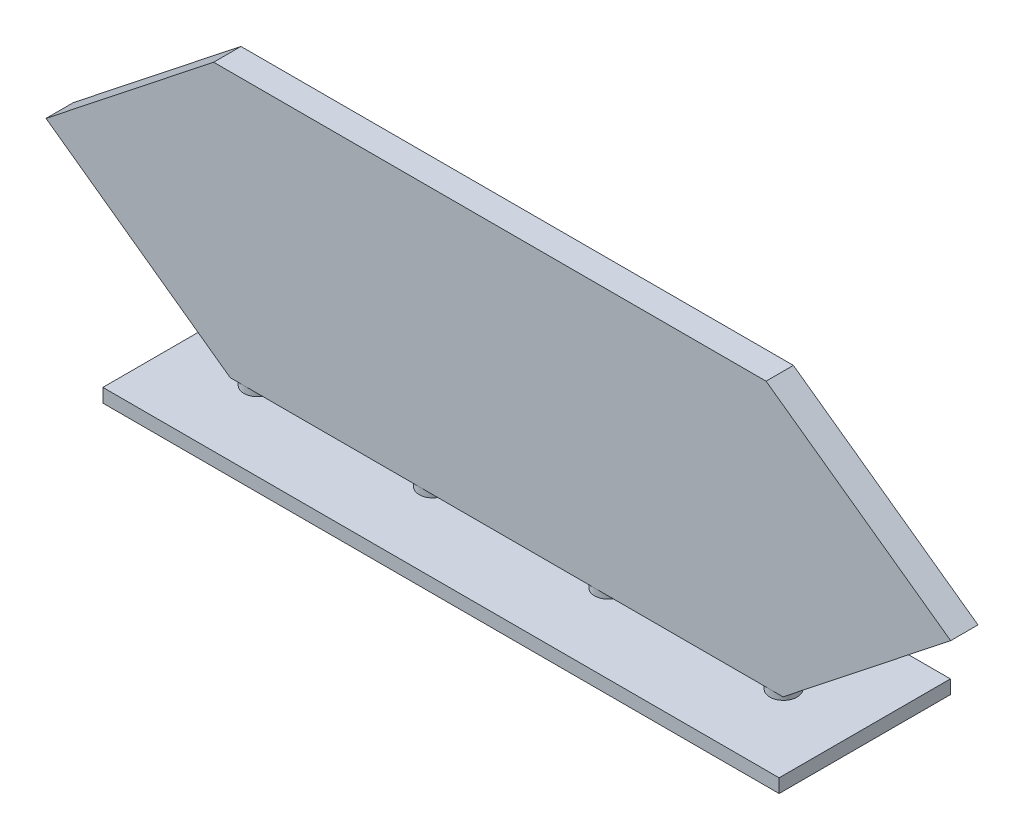
ISO-10303-21;
HEADER;
FILE_DESCRIPTION(('STEP AP214'),'2;1');
FILE_NAME('part.step','',(''),(''),'','','');
FILE_SCHEMA(('AUTOMOTIVE_DESIGN { 1 0 10303 214 1 1 1 1 }'));
ENDSEC;
DATA;
#1=APPLICATION_CONTEXT('core data for automotive mechanical design processes');
#2=APPLICATION_PROTOCOL_DEFINITION('international standard','automotive_design',2000,#1);
#3=PRODUCT_CONTEXT('',#1,'mechanical');
#4=PRODUCT('Part','Part','',(#3));
#5=PRODUCT_RELATED_PRODUCT_CATEGORY('part','',(#4));
#6=PRODUCT_DEFINITION_FORMATION('','',#4);
#7=PRODUCT_DEFINITION_CONTEXT('part definition',#1,'design');
#8=PRODUCT_DEFINITION('design','',#6,#7);
#9=PRODUCT_DEFINITION_SHAPE('','',#8);
#10=(LENGTH_UNIT() NAMED_UNIT(*) SI_UNIT(.MILLI.,.METRE.));
#11=(NAMED_UNIT(*) PLANE_ANGLE_UNIT() SI_UNIT($,.RADIAN.));
#12=(NAMED_UNIT(*) SI_UNIT($,.STERADIAN.) SOLID_ANGLE_UNIT());
#13=UNCERTAINTY_MEASURE_WITH_UNIT(LENGTH_MEASURE(1.E-05),#10,'distance_accuracy_value','');
#14=(GEOMETRIC_REPRESENTATION_CONTEXT(3) GLOBAL_UNCERTAINTY_ASSIGNED_CONTEXT((#13)) GLOBAL_UNIT_ASSIGNED_CONTEXT((#10,
#11,#12)) REPRESENTATION_CONTEXT('',''));
#15=CARTESIAN_POINT('',(0.,0.,0.));
#16=DIRECTION('',(0.,0.,1.));
#17=DIRECTION('',(1.,0.,0.));
#18=AXIS2_PLACEMENT_3D('',#15,#16,#17);
#19=CARTESIAN_POINT('',(-11.9054966201371,-5.81721391101613,0.));
#20=DIRECTION('',(0.,-1.,0.));
#21=DIRECTION('',(0.,0.,-1.));
#22=AXIS2_PLACEMENT_3D('',#19,#20,#21);
#23=PLANE('',#22);
#24=DIRECTION('',(1.,0.,0.));
#25=VECTOR('',#24,1.);
#26=CARTESIAN_POINT('',(-11.9054966201371,-5.81721391101613,1.2));
#27=LINE('',#26,#25);
#28=CARTESIAN_POINT('',(11.9233913677894,-5.81721391101613,1.2));
#29=VERTEX_POINT('',#28);
#30=CARTESIAN_POINT('',(12.5032995667402,-5.81721391101613,1.2));
#31=VERTEX_POINT('',#30);
#32=EDGE_CURVE('E301',#29,#31,#27,.T.);
#33=ORIENTED_EDGE('',*,*,#32,.F.);
#34=CARTESIAN_POINT('',(11.9233913677894,-5.81721391101613,0.6));
#35=DIRECTION('',(0.,-1.,0.));
#36=DIRECTION('',(0.,0.,-1.));
#37=AXIS2_PLACEMENT_3D('',#34,#35,#36);
#38=CIRCLE('',#37,0.6);
#39=CARTESIAN_POINT('',(12.5032995667402,-5.81721391101613,0.753969090370698));
#40=VERTEX_POINT('',#39);
#41=EDGE_CURVE('E384',#40,#29,#38,.T.);
#42=ORIENTED_EDGE('',*,*,#41,.F.);
#43=DIRECTION('',(0.,0.,1.));
#44=VECTOR('',#43,1.);
#45=CARTESIAN_POINT('',(12.5032995667402,-5.81721391101613,0.));
#46=LINE('',#45,#44);
#47=EDGE_CURVE('E316',#40,#31,#46,.T.);
#48=ORIENTED_EDGE('',*,*,#47,.T.);
#49=EDGE_LOOP('',(#33,#42,#48));
#50=FACE_BOUND('',#49,.T.);
#51=ADVANCED_FACE('F79',(#50),#23,.T.);
#52=DIRECTION('',(1.,0.,0.));
#53=VECTOR('',#52,1.);
#54=CARTESIAN_POINT('',(-11.9054966201371,-5.81721391101613,0.));
#55=LINE('',#54,#53);
#56=CARTESIAN_POINT('',(4.22339136778937,-5.81721391101613,0.));
#57=VERTEX_POINT('',#56);
#58=CARTESIAN_POINT('',(11.9233913677894,-5.81721391101613,0.));
#59=VERTEX_POINT('',#58);
#60=EDGE_CURVE('E394',#57,#59,#55,.T.);
#61=ORIENTED_EDGE('',*,*,#60,.T.);
#62=EDGE_CURVE('E227',#29,#59,#38,.T.);
#63=ORIENTED_EDGE('',*,*,#62,.F.);
#64=CARTESIAN_POINT('',(4.22339136778937,-5.81721391101613,1.2));
#65=VERTEX_POINT('',#64);
#66=EDGE_CURVE('E374',#65,#29,#27,.T.);
#67=ORIENTED_EDGE('',*,*,#66,.F.);
#68=CARTESIAN_POINT('',(4.22339136778937,-5.81721391101613,0.6));
#69=DIRECTION('',(0.,-1.,0.));
#70=DIRECTION('',(0.,0.,-1.));
#71=AXIS2_PLACEMENT_3D('',#68,#69,#70);
#72=CIRCLE('',#71,0.6);
#73=EDGE_CURVE('E239',#57,#65,#72,.T.);
#74=ORIENTED_EDGE('',*,*,#73,.F.);
#75=EDGE_LOOP('',(#61,#63,#67,#74));
#76=FACE_BOUND('',#75,.T.);
#77=ADVANCED_FACE('F391',(#76),#23,.T.);
#78=CARTESIAN_POINT('',(-3.47660863221063,-5.81721391101613,0.));
#79=VERTEX_POINT('',#78);
#80=EDGE_CURVE('E404',#79,#57,#55,.T.);
#81=ORIENTED_EDGE('',*,*,#80,.T.);
#82=EDGE_CURVE('E243',#65,#57,#72,.T.);
#83=ORIENTED_EDGE('',*,*,#82,.F.);
#84=CARTESIAN_POINT('',(-3.47660863221063,-5.81721391101613,1.2));
#85=VERTEX_POINT('',#84);
#86=EDGE_CURVE('E372',#85,#65,#27,.T.);
#87=ORIENTED_EDGE('',*,*,#86,.F.);
#88=CARTESIAN_POINT('',(-3.47660863221063,-5.81721391101613,0.6));
#89=DIRECTION('',(0.,-1.,0.));
#90=DIRECTION('',(0.,0.,-1.));
#91=AXIS2_PLACEMENT_3D('',#88,#89,#90);
#92=CIRCLE('',#91,0.6);
#93=EDGE_CURVE('E247',#79,#85,#92,.T.);
#94=ORIENTED_EDGE('',*,*,#93,.F.);
#95=EDGE_LOOP('',(#81,#83,#87,#94));
#96=FACE_BOUND('',#95,.T.);
#97=ADVANCED_FACE('F432',(#96),#23,.T.);
#98=CARTESIAN_POINT('',(-11.1766086322106,-5.81721391101613,0.));
#99=VERTEX_POINT('',#98);
#100=EDGE_CURVE('E282',#99,#79,#55,.T.);
#101=ORIENTED_EDGE('',*,*,#100,.T.);
#102=EDGE_CURVE('E250',#85,#79,#92,.T.);
#103=ORIENTED_EDGE('',*,*,#102,.F.);
#104=CARTESIAN_POINT('',(-11.1766086322106,-5.81721391101613,1.2));
#105=VERTEX_POINT('',#104);
#106=EDGE_CURVE('E306',#105,#85,#27,.T.);
#107=ORIENTED_EDGE('',*,*,#106,.F.);
#108=CARTESIAN_POINT('',(-11.1766086322106,-5.81721391101613,0.6));
#109=DIRECTION('',(0.,-1.,0.));
#110=DIRECTION('',(0.,0.,-1.));
#111=AXIS2_PLACEMENT_3D('',#108,#109,#110);
#112=CIRCLE('',#111,0.6);
#113=EDGE_CURVE('E91',#99,#105,#112,.T.);
#114=ORIENTED_EDGE('',*,*,#113,.F.);
#115=EDGE_LOOP('',(#101,#103,#107,#114));
#116=FACE_BOUND('',#115,.T.);
#117=ADVANCED_FACE('F368',(#116),#23,.T.);
#118=CARTESIAN_POINT('',(12.5032995667402,-5.81721391101613,0.));
#119=VERTEX_POINT('',#118);
#120=CARTESIAN_POINT('',(12.5032995667402,-5.81721391101613,0.446030909629301));
#121=VERTEX_POINT('',#120);
#122=EDGE_CURVE('E313',#119,#121,#46,.T.);
#123=ORIENTED_EDGE('',*,*,#122,.T.);
#124=EDGE_CURVE('E98',#59,#121,#38,.T.);
#125=ORIENTED_EDGE('',*,*,#124,.F.);
#126=EDGE_CURVE('E277',#59,#119,#55,.T.);
#127=ORIENTED_EDGE('',*,*,#126,.T.);
#128=EDGE_LOOP('',(#123,#125,#127));
#129=FACE_BOUND('',#128,.T.);
#130=ADVANCED_FACE('F412',(#129),#23,.T.);
#131=CARTESIAN_POINT('',(-11.7766086322106,-5.81721391101613,0.6));
#132=VERTEX_POINT('',#131);
#133=EDGE_CURVE('E12',#105,#132,#112,.T.);
#134=ORIENTED_EDGE('',*,*,#133,.F.);
#135=CARTESIAN_POINT('',(-11.7766086322106,-5.81721391101613,1.2));
#136=VERTEX_POINT('',#135);
#137=EDGE_CURVE('E302',#136,#105,#27,.T.);
#138=ORIENTED_EDGE('',*,*,#137,.F.);
#139=DIRECTION('',(0.,0.,1.));
#140=VECTOR('',#139,1.);
#141=CARTESIAN_POINT('',(-11.7766086322106,-5.81721391101613,0.));
#142=LINE('',#141,#140);
#143=EDGE_CURVE('E321',#132,#136,#142,.T.);
#144=ORIENTED_EDGE('',*,*,#143,.F.);
#145=EDGE_LOOP('',(#134,#138,#144));
#146=FACE_BOUND('',#145,.T.);
#147=ADVANCED_FACE('F360',(#146),#23,.T.);
#148=CARTESIAN_POINT('',(0.,0.,0.));
#149=DIRECTION('',(0.,0.,-1.));
#150=DIRECTION('',(-1.,0.,0.));
#151=AXIS2_PLACEMENT_3D('',#148,#149,#150);
#152=PLANE('',#151);
#153=DIRECTION('',(-1.,0.,0.));
#154=VECTOR('',#153,1.);
#155=CARTESIAN_POINT('',(11.8866222607191,5.81721391101613,0.));
#156=LINE('',#155,#154);
#157=CARTESIAN_POINT('',(11.7579690343913,5.81721391101613,0.));
#158=VERTEX_POINT('',#157);
#159=CARTESIAN_POINT('',(-12.5037603710876,5.81721391101613,0.));
#160=VERTEX_POINT('',#159);
#161=EDGE_CURVE('E264',#158,#160,#156,.T.);
#162=ORIENTED_EDGE('',*,*,#161,.F.);
#163=DIRECTION('',(-0.812500733959519,0.582960167863331,0.));
#164=VECTOR('',#163,1.);
#165=CARTESIAN_POINT('',(20.2972193800577,-0.309602480493432,0.));
#166=LINE('',#165,#164);
#167=CARTESIAN_POINT('',(19.86571092287,0.,0.));
#168=VERTEX_POINT('',#167);
#169=EDGE_CURVE('E261',#168,#158,#166,.T.);
#170=ORIENTED_EDGE('',*,*,#169,.F.);
#171=DIRECTION('',(0.78463474581421,0.619958317680366,0.));
#172=VECTOR('',#171,1.);
#173=CARTESIAN_POINT('',(12.3942709068087,-5.90336001269044,0.));
#174=LINE('',#173,#172);
#175=EDGE_CURVE('E281',#119,#168,#174,.T.);
#176=ORIENTED_EDGE('',*,*,#175,.F.);
#177=ORIENTED_EDGE('',*,*,#126,.F.);
#178=ORIENTED_EDGE('',*,*,#60,.F.);
#179=ORIENTED_EDGE('',*,*,#80,.F.);
#180=ORIENTED_EDGE('',*,*,#100,.F.);
#181=CARTESIAN_POINT('',(-11.7766086322106,-5.81721391101613,0.));
#182=VERTEX_POINT('',#181);
#183=EDGE_CURVE('E278',#182,#99,#55,.T.);
#184=ORIENTED_EDGE('',*,*,#183,.F.);
#185=DIRECTION('',(0.811880248653877,-0.583823999032001,0.));
#186=VECTOR('',#185,1.);
#187=CARTESIAN_POINT('',(-20.2968738475903,0.309718378695081,0.));
#188=LINE('',#187,#186);
#189=CARTESIAN_POINT('',(-19.8661717272174,0.,0.));
#190=VERTEX_POINT('',#189);
#191=EDGE_CURVE('E273',#190,#182,#188,.T.);
#192=ORIENTED_EDGE('',*,*,#191,.F.);
#193=DIRECTION('',(-0.784634745814211,-0.619958317680365,0.));
#194=VECTOR('',#193,1.);
#195=CARTESIAN_POINT('',(-12.3947317111561,5.90336001269044,0.));
#196=LINE('',#195,#194);
#197=EDGE_CURVE('E269',#160,#190,#196,.T.);
#198=ORIENTED_EDGE('',*,*,#197,.F.);
#199=EDGE_LOOP('',(#162,#170,#176,#177,#178,#179,#180,#184,#192,#198));
#200=FACE_BOUND('',#199,.T.);
#201=ADVANCED_FACE('F81',(#200),#152,.T.);
#202=CARTESIAN_POINT('',(20.2972193800577,-0.309602480493432,0.));
#203=DIRECTION('',(0.582960167863331,0.812500733959519,0.));
#204=DIRECTION('',(-0.812500733959519,0.582960167863331,0.));
#205=AXIS2_PLACEMENT_3D('',#202,#203,#204);
#206=PLANE('',#205);
#207=DIRECTION('',(-0.812500733959519,0.582960167863331,0.));
#208=VECTOR('',#207,1.);
#209=CARTESIAN_POINT('',(20.2972193800577,-0.309602480493432,1.2));
#210=LINE('',#209,#208);
#211=CARTESIAN_POINT('',(19.86571092287,0.,1.2));
#212=VERTEX_POINT('',#211);
#213=CARTESIAN_POINT('',(11.7579690343913,5.81721391101613,1.2));
#214=VERTEX_POINT('',#213);
#215=EDGE_CURVE('E257',#212,#214,#210,.T.);
#216=ORIENTED_EDGE('',*,*,#215,.F.);
#217=DIRECTION('',(0.,0.,1.));
#218=VECTOR('',#217,1.);
#219=CARTESIAN_POINT('',(19.86571092287,0.,0.));
#220=LINE('',#219,#218);
#221=EDGE_CURVE('E310',#168,#212,#220,.T.);
#222=ORIENTED_EDGE('',*,*,#221,.F.);
#223=ORIENTED_EDGE('',*,*,#169,.T.);
#224=DIRECTION('',(0.,0.,1.));
#225=VECTOR('',#224,1.);
#226=CARTESIAN_POINT('',(11.7579690343913,5.81721391101613,0.));
#227=LINE('',#226,#225);
#228=EDGE_CURVE('E83',#158,#214,#227,.T.);
#229=ORIENTED_EDGE('',*,*,#228,.T.);
#230=EDGE_LOOP('',(#216,#222,#223,#229));
#231=FACE_BOUND('',#230,.T.);
#232=ADVANCED_FACE('F333',(#231),#206,.T.);
#233=CARTESIAN_POINT('',(12.3942709068087,-5.90336001269044,0.));
#234=DIRECTION('',(0.619958317680366,-0.78463474581421,0.));
#235=DIRECTION('',(0.784634745814211,0.619958317680366,0.));
#236=AXIS2_PLACEMENT_3D('',#233,#234,#235);
#237=PLANE('',#236);
#238=DIRECTION('',(0.78463474581421,0.619958317680366,0.));
#239=VECTOR('',#238,1.);
#240=CARTESIAN_POINT('',(12.3942709068087,-5.90336001269044,1.2));
#241=LINE('',#240,#239);
#242=EDGE_CURVE('E265',#31,#212,#241,.T.);
#243=ORIENTED_EDGE('',*,*,#242,.F.);
#244=ORIENTED_EDGE('',*,*,#47,.F.);
#245=DIRECTION('',(0.,0.,-1.));
#246=VECTOR('',#245,1.);
#247=CARTESIAN_POINT('',(12.5032995667402,-5.81721391101613,0.));
#248=LINE('',#247,#246);
#249=EDGE_CURVE('E106',#40,#121,#248,.T.);
#250=ORIENTED_EDGE('',*,*,#249,.T.);
#251=ORIENTED_EDGE('',*,*,#122,.F.);
#252=ORIENTED_EDGE('',*,*,#175,.T.);
#253=ORIENTED_EDGE('',*,*,#221,.T.);
#254=EDGE_LOOP('',(#243,#244,#250,#251,#252,#253));
#255=FACE_BOUND('',#254,.T.);
#256=ADVANCED_FACE('F343',(#255),#237,.T.);
#257=EDGE_CURVE('E89',#132,#99,#112,.T.);
#258=ORIENTED_EDGE('',*,*,#257,.F.);
#259=EDGE_CURVE('E317',#182,#132,#142,.T.);
#260=ORIENTED_EDGE('',*,*,#259,.F.);
#261=ORIENTED_EDGE('',*,*,#183,.T.);
#262=EDGE_LOOP('',(#258,#260,#261));
#263=FACE_BOUND('',#262,.T.);
#264=ADVANCED_FACE('F400',(#263),#23,.T.);
#265=CARTESIAN_POINT('',(-20.2968738475903,0.309718378695081,0.));
#266=DIRECTION('',(-0.583823999032001,-0.811880248653877,0.));
#267=DIRECTION('',(0.811880248653877,-0.583823999032002,0.));
#268=AXIS2_PLACEMENT_3D('',#265,#266,#267);
#269=PLANE('',#268);
#270=DIRECTION('',(0.811880248653877,-0.583823999032001,0.));
#271=VECTOR('',#270,1.);
#272=CARTESIAN_POINT('',(-20.2968738475903,0.309718378695081,1.2));
#273=LINE('',#272,#271);
#274=CARTESIAN_POINT('',(-19.8661717272174,0.,1.2));
#275=VERTEX_POINT('',#274);
#276=EDGE_CURVE('E297',#275,#136,#273,.T.);
#277=ORIENTED_EDGE('',*,*,#276,.F.);
#278=DIRECTION('',(0.,0.,1.));
#279=VECTOR('',#278,1.);
#280=CARTESIAN_POINT('',(-19.8661717272174,0.,0.));
#281=LINE('',#280,#279);
#282=EDGE_CURVE('E322',#190,#275,#281,.T.);
#283=ORIENTED_EDGE('',*,*,#282,.F.);
#284=ORIENTED_EDGE('',*,*,#191,.T.);
#285=ORIENTED_EDGE('',*,*,#259,.T.);
#286=ORIENTED_EDGE('',*,*,#143,.T.);
#287=EDGE_LOOP('',(#277,#283,#284,#285,#286));
#288=FACE_BOUND('',#287,.T.);
#289=ADVANCED_FACE('F356',(#288),#269,.T.);
#290=CARTESIAN_POINT('',(-12.3947317111561,5.90336001269044,0.));
#291=DIRECTION('',(-0.619958317680365,0.784634745814211,0.));
#292=DIRECTION('',(-0.784634745814211,-0.619958317680365,0.));
#293=AXIS2_PLACEMENT_3D('',#290,#291,#292);
#294=PLANE('',#293);
#295=DIRECTION('',(-0.784634745814211,-0.619958317680365,0.));
#296=VECTOR('',#295,1.);
#297=CARTESIAN_POINT('',(-12.3947317111561,5.90336001269044,1.2));
#298=LINE('',#297,#296);
#299=CARTESIAN_POINT('',(-12.5037603710876,5.81721391101613,1.2));
#300=VERTEX_POINT('',#299);
#301=EDGE_CURVE('E293',#300,#275,#298,.T.);
#302=ORIENTED_EDGE('',*,*,#301,.F.);
#303=DIRECTION('',(0.,0.,1.));
#304=VECTOR('',#303,1.);
#305=CARTESIAN_POINT('',(-12.5037603710876,5.81721391101613,0.));
#306=LINE('',#305,#304);
#307=EDGE_CURVE('E324',#160,#300,#306,.T.);
#308=ORIENTED_EDGE('',*,*,#307,.F.);
#309=ORIENTED_EDGE('',*,*,#197,.T.);
#310=ORIENTED_EDGE('',*,*,#282,.T.);
#311=EDGE_LOOP('',(#302,#308,#309,#310));
#312=FACE_BOUND('',#311,.T.);
#313=ADVANCED_FACE('F351',(#312),#294,.T.);
#314=CARTESIAN_POINT('',(11.8866222607191,5.81721391101613,0.));
#315=DIRECTION('',(0.,1.,0.));
#316=DIRECTION('',(0.,0.,1.));
#317=AXIS2_PLACEMENT_3D('',#314,#315,#316);
#318=PLANE('',#317);
#319=DIRECTION('',(-1.,0.,0.));
#320=VECTOR('',#319,1.);
#321=CARTESIAN_POINT('',(11.8866222607191,5.81721391101613,1.2));
#322=LINE('',#321,#320);
#323=EDGE_CURVE('E289',#214,#300,#322,.T.);
#324=ORIENTED_EDGE('',*,*,#323,.F.);
#325=ORIENTED_EDGE('',*,*,#228,.F.);
#326=ORIENTED_EDGE('',*,*,#161,.T.);
#327=ORIENTED_EDGE('',*,*,#307,.T.);
#328=EDGE_LOOP('',(#324,#325,#326,#327));
#329=FACE_BOUND('',#328,.T.);
#330=ADVANCED_FACE('F336',(#329),#318,.T.);
#331=CARTESIAN_POINT('',(0.,0.,1.2));
#332=DIRECTION('',(0.,0.,-1.));
#333=DIRECTION('',(-1.,0.,0.));
#334=AXIS2_PLACEMENT_3D('',#331,#332,#333);
#335=PLANE('',#334);
#336=ORIENTED_EDGE('',*,*,#215,.T.);
#337=ORIENTED_EDGE('',*,*,#323,.T.);
#338=ORIENTED_EDGE('',*,*,#301,.T.);
#339=ORIENTED_EDGE('',*,*,#276,.T.);
#340=ORIENTED_EDGE('',*,*,#137,.T.);
#341=ORIENTED_EDGE('',*,*,#106,.T.);
#342=ORIENTED_EDGE('',*,*,#86,.T.);
#343=ORIENTED_EDGE('',*,*,#66,.T.);
#344=ORIENTED_EDGE('',*,*,#32,.T.);
#345=ORIENTED_EDGE('',*,*,#242,.T.);
#346=EDGE_LOOP('',(#336,#337,#338,#339,#340,#341,#342,#343,#344,#345));
#347=FACE_BOUND('',#346,.T.);
#348=ADVANCED_FACE('F338',(#347),#335,.F.);
#349=CARTESIAN_POINT('',(-11.1766086322106,-6.11721391101613,0.6));
#350=DIRECTION('',(0.,1.,0.));
#351=DIRECTION('',(0.,0.,1.));
#352=AXIS2_PLACEMENT_3D('',#349,#350,#351);
#353=CYLINDRICAL_SURFACE('',#352,0.6);
#354=CARTESIAN_POINT('',(-11.1766086322106,-6.11721391101613,0.6));
#355=DIRECTION('',(0.,-1.,0.));
#356=DIRECTION('',(0.,0.,-1.));
#357=AXIS2_PLACEMENT_3D('',#354,#355,#356);
#358=CIRCLE('',#357,0.6);
#359=CARTESIAN_POINT('',(-11.1766086322106,-6.11721391101613,0.));
#360=VERTEX_POINT('',#359);
#361=EDGE_CURVE('E254',#360,#360,#358,.T.);
#362=ORIENTED_EDGE('',*,*,#361,.F.);
#363=EDGE_LOOP('',(#362));
#364=FACE_BOUND('',#363,.T.);
#365=ORIENTED_EDGE('',*,*,#113,.T.);
#366=ORIENTED_EDGE('',*,*,#133,.T.);
#367=ORIENTED_EDGE('',*,*,#257,.T.);
#368=EDGE_LOOP('',(#365,#366,#367));
#369=FACE_BOUND('',#368,.T.);
#370=ADVANCED_FACE('F398',(#364,#369),#353,.T.);
#371=CARTESIAN_POINT('',(-3.47660863221063,-6.11721391101613,0.6));
#372=DIRECTION('',(0.,1.,0.));
#373=DIRECTION('',(0.,0.,1.));
#374=AXIS2_PLACEMENT_3D('',#371,#372,#373);
#375=CYLINDRICAL_SURFACE('',#374,0.6);
#376=CARTESIAN_POINT('',(-3.47660863221063,-6.11721391101613,0.6));
#377=DIRECTION('',(0.,-1.,0.));
#378=DIRECTION('',(0.,0.,-1.));
#379=AXIS2_PLACEMENT_3D('',#376,#377,#378);
#380=CIRCLE('',#379,0.6);
#381=CARTESIAN_POINT('',(-3.47660863221063,-6.11721391101613,0.));
#382=VERTEX_POINT('',#381);
#383=EDGE_CURVE('E242',#382,#382,#380,.T.);
#384=ORIENTED_EDGE('',*,*,#383,.F.);
#385=EDGE_LOOP('',(#384));
#386=FACE_BOUND('',#385,.T.);
#387=ORIENTED_EDGE('',*,*,#93,.T.);
#388=ORIENTED_EDGE('',*,*,#102,.T.);
#389=EDGE_LOOP('',(#387,#388));
#390=FACE_BOUND('',#389,.T.);
#391=ADVANCED_FACE('F529',(#386,#390),#375,.T.);
#392=CARTESIAN_POINT('',(4.22339136778937,-6.11721391101613,0.6));
#393=DIRECTION('',(0.,1.,0.));
#394=DIRECTION('',(0.,0.,1.));
#395=AXIS2_PLACEMENT_3D('',#392,#393,#394);
#396=CYLINDRICAL_SURFACE('',#395,0.6);
#397=CARTESIAN_POINT('',(4.22339136778937,-6.11721391101613,0.6));
#398=DIRECTION('',(0.,-1.,0.));
#399=DIRECTION('',(0.,0.,-1.));
#400=AXIS2_PLACEMENT_3D('',#397,#398,#399);
#401=CIRCLE('',#400,0.6);
#402=CARTESIAN_POINT('',(4.22339136778937,-6.11721391101613,0.));
#403=VERTEX_POINT('',#402);
#404=EDGE_CURVE('E238',#403,#403,#401,.T.);
#405=ORIENTED_EDGE('',*,*,#404,.F.);
#406=EDGE_LOOP('',(#405));
#407=FACE_BOUND('',#406,.T.);
#408=ORIENTED_EDGE('',*,*,#73,.T.);
#409=ORIENTED_EDGE('',*,*,#82,.T.);
#410=EDGE_LOOP('',(#408,#409));
#411=FACE_BOUND('',#410,.T.);
#412=ADVANCED_FACE('F423',(#407,#411),#396,.T.);
#413=CARTESIAN_POINT('',(11.9233913677894,-6.11721391101613,0.6));
#414=DIRECTION('',(0.,1.,0.));
#415=DIRECTION('',(0.,0.,1.));
#416=AXIS2_PLACEMENT_3D('',#413,#414,#415);
#417=CYLINDRICAL_SURFACE('',#416,0.6);
#418=CARTESIAN_POINT('',(11.9233913677894,-6.11721391101613,0.6));
#419=DIRECTION('',(0.,-1.,0.));
#420=DIRECTION('',(0.,0.,-1.));
#421=AXIS2_PLACEMENT_3D('',#418,#419,#420);
#422=CIRCLE('',#421,0.6);
#423=CARTESIAN_POINT('',(11.9233913677894,-6.11721391101613,0.));
#424=VERTEX_POINT('',#423);
#425=EDGE_CURVE('E222',#424,#424,#422,.T.);
#426=ORIENTED_EDGE('',*,*,#425,.F.);
#427=EDGE_LOOP('',(#426));
#428=FACE_BOUND('',#427,.T.);
#429=ORIENTED_EDGE('',*,*,#124,.T.);
#430=EDGE_CURVE('E234',#121,#40,#38,.T.);
#431=ORIENTED_EDGE('',*,*,#430,.T.);
#432=ORIENTED_EDGE('',*,*,#41,.T.);
#433=ORIENTED_EDGE('',*,*,#62,.T.);
#434=EDGE_LOOP('',(#429,#431,#432,#433));
#435=FACE_BOUND('',#434,.T.);
#436=ADVANCED_FACE('F388',(#428,#435),#417,.T.);
#437=CARTESIAN_POINT('',(11.9233913677894,-5.81721391101613,0.6));
#438=DIRECTION('',(0.,-1.,0.));
#439=DIRECTION('',(0.,0.,-1.));
#440=AXIS2_PLACEMENT_3D('',#437,#438,#439);
#441=PLANE('',#440);
#442=ORIENTED_EDGE('',*,*,#249,.F.);
#443=ORIENTED_EDGE('',*,*,#430,.F.);
#444=EDGE_LOOP('',(#442,#443));
#445=FACE_BOUND('',#444,.T.);
#446=ADVANCED_FACE('F415',(#445),#441,.F.);
#447=CARTESIAN_POINT('',(-14.5033461385482,-6.71721391101613,4.0649081964035));
#448=DIRECTION('',(1.,0.,0.));
#449=DIRECTION('',(0.,0.,-1.));
#450=AXIS2_PLACEMENT_3D('',#447,#448,#449);
#451=PLANE('',#450);
#452=DIRECTION('',(0.,0.,-1.));
#453=VECTOR('',#452,1.);
#454=CARTESIAN_POINT('',(-14.5033461385482,-6.11721391101613,4.0649081964035));
#455=LINE('',#454,#453);
#456=CARTESIAN_POINT('',(-14.5033461385482,-6.11721391101613,4.0649081964035));
#457=VERTEX_POINT('',#456);
#458=CARTESIAN_POINT('',(-14.5033461385482,-6.11721391101613,-3.45889245864401));
#459=VERTEX_POINT('',#458);
#460=EDGE_CURVE('E220',#457,#459,#455,.T.);
#461=ORIENTED_EDGE('',*,*,#460,.T.);
#462=DIRECTION('',(0.,1.,0.));
#463=VECTOR('',#462,1.);
#464=CARTESIAN_POINT('',(-14.5033461385482,-6.71721391101613,-3.45889245864401));
#465=LINE('',#464,#463);
#466=CARTESIAN_POINT('',(-14.5033461385482,-6.71721391101613,-3.45889245864401));
#467=VERTEX_POINT('',#466);
#468=EDGE_CURVE('E198',#467,#459,#465,.T.);
#469=ORIENTED_EDGE('',*,*,#468,.F.);
#470=DIRECTION('',(0.,0.,-1.));
#471=VECTOR('',#470,1.);
#472=CARTESIAN_POINT('',(-14.5033461385482,-6.71721391101613,4.0649081964035));
#473=LINE('',#472,#471);
#474=CARTESIAN_POINT('',(-14.5033461385482,-6.71721391101613,4.0649081964035));
#475=VERTEX_POINT('',#474);
#476=EDGE_CURVE('E206',#475,#467,#473,.T.);
#477=ORIENTED_EDGE('',*,*,#476,.F.);
#478=DIRECTION('',(0.,1.,0.));
#479=VECTOR('',#478,1.);
#480=CARTESIAN_POINT('',(-14.5033461385482,-6.71721391101613,4.0649081964035));
#481=LINE('',#480,#479);
#482=EDGE_CURVE('E659',#475,#457,#481,.T.);
#483=ORIENTED_EDGE('',*,*,#482,.T.);
#484=EDGE_LOOP('',(#461,#469,#477,#483));
#485=FACE_BOUND('',#484,.T.);
#486=ADVANCED_FACE('F218',(#485),#451,.F.);
#487=CARTESIAN_POINT('',(-14.5033461385482,-6.71721391101613,-3.45889245864401));
#488=DIRECTION('',(0.,0.,1.));
#489=DIRECTION('',(1.,0.,0.));
#490=AXIS2_PLACEMENT_3D('',#487,#488,#489);
#491=PLANE('',#490);
#492=DIRECTION('',(1.,0.,0.));
#493=VECTOR('',#492,1.);
#494=CARTESIAN_POINT('',(-14.5033461385482,-6.11721391101613,-3.45889245864401));
#495=LINE('',#494,#493);
#496=CARTESIAN_POINT('',(15.1958669734814,-6.11721391101613,-3.45889245864401));
#497=VERTEX_POINT('',#496);
#498=EDGE_CURVE('E646',#459,#497,#495,.T.);
#499=ORIENTED_EDGE('',*,*,#498,.T.);
#500=DIRECTION('',(0.,1.,0.));
#501=VECTOR('',#500,1.);
#502=CARTESIAN_POINT('',(15.1958669734814,-6.71721391101613,-3.45889245864401));
#503=LINE('',#502,#501);
#504=CARTESIAN_POINT('',(15.1958669734814,-6.71721391101613,-3.45889245864401));
#505=VERTEX_POINT('',#504);
#506=EDGE_CURVE('E201',#505,#497,#503,.T.);
#507=ORIENTED_EDGE('',*,*,#506,.F.);
#508=DIRECTION('',(1.,0.,0.));
#509=VECTOR('',#508,1.);
#510=CARTESIAN_POINT('',(-14.5033461385482,-6.71721391101613,-3.45889245864401));
#511=LINE('',#510,#509);
#512=EDGE_CURVE('E194',#467,#505,#511,.T.);
#513=ORIENTED_EDGE('',*,*,#512,.F.);
#514=ORIENTED_EDGE('',*,*,#468,.T.);
#515=EDGE_LOOP('',(#499,#507,#513,#514));
#516=FACE_BOUND('',#515,.T.);
#517=ADVANCED_FACE('F196',(#516),#491,.F.);
#518=CARTESIAN_POINT('',(15.1958669734814,-6.71721391101613,4.0649081964035));
#519=DIRECTION('',(-1.,0.,0.));
#520=DIRECTION('',(0.,0.,1.));
#521=AXIS2_PLACEMENT_3D('',#518,#519,#520);
#522=PLANE('',#521);
#523=DIRECTION('',(0.,0.,1.));
#524=VECTOR('',#523,1.);
#525=CARTESIAN_POINT('',(15.1958669734814,-6.11721391101613,4.0649081964035));
#526=LINE('',#525,#524);
#527=CARTESIAN_POINT('',(15.1958669734814,-6.11721391101613,4.0649081964035));
#528=VERTEX_POINT('',#527);
#529=EDGE_CURVE('E650',#497,#528,#526,.T.);
#530=ORIENTED_EDGE('',*,*,#529,.T.);
#531=DIRECTION('',(0.,1.,0.));
#532=VECTOR('',#531,1.);
#533=CARTESIAN_POINT('',(15.1958669734814,-6.71721391101613,4.0649081964035));
#534=LINE('',#533,#532);
#535=CARTESIAN_POINT('',(15.1958669734814,-6.71721391101613,4.0649081964035));
#536=VERTEX_POINT('',#535);
#537=EDGE_CURVE('E229',#536,#528,#534,.T.);
#538=ORIENTED_EDGE('',*,*,#537,.F.);
#539=DIRECTION('',(0.,0.,1.));
#540=VECTOR('',#539,1.);
#541=CARTESIAN_POINT('',(15.1958669734814,-6.71721391101613,4.0649081964035));
#542=LINE('',#541,#540);
#543=EDGE_CURVE('E205',#505,#536,#542,.T.);
#544=ORIENTED_EDGE('',*,*,#543,.F.);
#545=ORIENTED_EDGE('',*,*,#506,.T.);
#546=EDGE_LOOP('',(#530,#538,#544,#545));
#547=FACE_BOUND('',#546,.T.);
#548=ADVANCED_FACE('F578',(#547),#522,.F.);
#549=CARTESIAN_POINT('',(-14.5033461385482,-6.71721391101613,4.0649081964035));
#550=DIRECTION('',(0.,0.,-1.));
#551=DIRECTION('',(-1.,0.,0.));
#552=AXIS2_PLACEMENT_3D('',#549,#550,#551);
#553=PLANE('',#552);
#554=DIRECTION('',(-1.,0.,0.));
#555=VECTOR('',#554,1.);
#556=CARTESIAN_POINT('',(-14.5033461385482,-6.11721391101613,4.0649081964035));
#557=LINE('',#556,#555);
#558=EDGE_CURVE('E216',#528,#457,#557,.T.);
#559=ORIENTED_EDGE('',*,*,#558,.T.);
#560=ORIENTED_EDGE('',*,*,#482,.F.);
#561=DIRECTION('',(-1.,0.,0.));
#562=VECTOR('',#561,1.);
#563=CARTESIAN_POINT('',(-14.5033461385482,-6.71721391101613,4.0649081964035));
#564=LINE('',#563,#562);
#565=EDGE_CURVE('E211',#536,#475,#564,.T.);
#566=ORIENTED_EDGE('',*,*,#565,.F.);
#567=ORIENTED_EDGE('',*,*,#537,.T.);
#568=EDGE_LOOP('',(#559,#560,#566,#567));
#569=FACE_BOUND('',#568,.T.);
#570=ADVANCED_FACE('F588',(#569),#553,.F.);
#571=CARTESIAN_POINT('',(0.,-6.71721391101613,0.));
#572=DIRECTION('',(0.,-1.,0.));
#573=DIRECTION('',(0.,0.,-1.));
#574=AXIS2_PLACEMENT_3D('',#571,#572,#573);
#575=PLANE('',#574);
#576=ORIENTED_EDGE('',*,*,#476,.T.);
#577=ORIENTED_EDGE('',*,*,#512,.T.);
#578=ORIENTED_EDGE('',*,*,#543,.T.);
#579=ORIENTED_EDGE('',*,*,#565,.T.);
#580=EDGE_LOOP('',(#576,#577,#578,#579));
#581=FACE_BOUND('',#580,.T.);
#582=ADVANCED_FACE('F209',(#581),#575,.T.);
#583=CARTESIAN_POINT('',(0.,-6.11721391101613,0.));
#584=DIRECTION('',(0.,-1.,0.));
#585=DIRECTION('',(0.,0.,-1.));
#586=AXIS2_PLACEMENT_3D('',#583,#584,#585);
#587=PLANE('',#586);
#588=ORIENTED_EDGE('',*,*,#361,.T.);
#589=EDGE_LOOP('',(#588));
#590=FACE_BOUND('',#589,.T.);
#591=ORIENTED_EDGE('',*,*,#383,.T.);
#592=EDGE_LOOP('',(#591));
#593=FACE_BOUND('',#592,.T.);
#594=ORIENTED_EDGE('',*,*,#404,.T.);
#595=EDGE_LOOP('',(#594));
#596=FACE_BOUND('',#595,.T.);
#597=ORIENTED_EDGE('',*,*,#425,.T.);
#598=EDGE_LOOP('',(#597));
#599=FACE_BOUND('',#598,.T.);
#600=ORIENTED_EDGE('',*,*,#460,.F.);
#601=ORIENTED_EDGE('',*,*,#558,.F.);
#602=ORIENTED_EDGE('',*,*,#529,.F.);
#603=ORIENTED_EDGE('',*,*,#498,.F.);
#604=EDGE_LOOP('',(#600,#601,#602,#603));
#605=FACE_BOUND('',#604,.T.);
#606=ADVANCED_FACE('F609',(#590,#593,#596,#599,#605),#587,.F.);
#607=CLOSED_SHELL('',(#51,#77,#97,#117,#130,#147,#201,#232,#256,#264,#289,#313,#330,#348,#370,
#391,#412,#436,#446,#486,#517,#548,#570,#582,#606));
#608=MANIFOLD_SOLID_BREP('B2',#607);
#609=ADVANCED_BREP_SHAPE_REPRESENTATION('',(#18,#608),#14);
#610=SHAPE_DEFINITION_REPRESENTATION(#9,#609);
ENDSEC;
END-ISO-10303-21;
